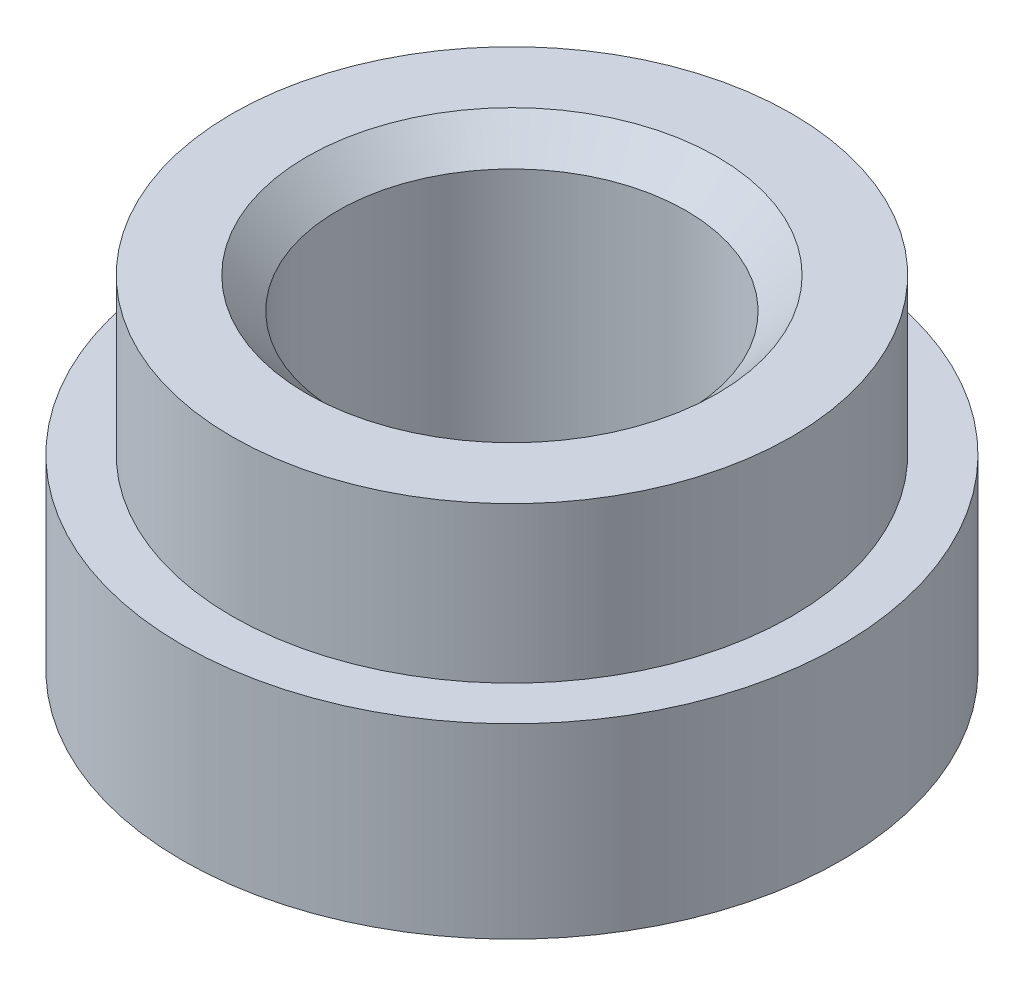
ISO-10303-21;
HEADER;
FILE_DESCRIPTION(('STEP AP214'),'2;1');
FILE_NAME('part.step','',(''),(''),'','','');
FILE_SCHEMA(('AUTOMOTIVE_DESIGN { 1 0 10303 214 1 1 1 1 }'));
ENDSEC;
DATA;
#1=APPLICATION_CONTEXT('core data for automotive mechanical design processes');
#2=APPLICATION_PROTOCOL_DEFINITION('international standard','automotive_design',2000,#1);
#3=PRODUCT_CONTEXT('',#1,'mechanical');
#4=PRODUCT('Part','Part','',(#3));
#5=PRODUCT_RELATED_PRODUCT_CATEGORY('part','',(#4));
#6=PRODUCT_DEFINITION_FORMATION('','',#4);
#7=PRODUCT_DEFINITION_CONTEXT('part definition',#1,'design');
#8=PRODUCT_DEFINITION('design','',#6,#7);
#9=PRODUCT_DEFINITION_SHAPE('','',#8);
#10=(LENGTH_UNIT() NAMED_UNIT(*) SI_UNIT(.MILLI.,.METRE.));
#11=(NAMED_UNIT(*) PLANE_ANGLE_UNIT() SI_UNIT($,.RADIAN.));
#12=(NAMED_UNIT(*) SI_UNIT($,.STERADIAN.) SOLID_ANGLE_UNIT());
#13=UNCERTAINTY_MEASURE_WITH_UNIT(LENGTH_MEASURE(1.E-05),#10,'distance_accuracy_value','');
#14=(GEOMETRIC_REPRESENTATION_CONTEXT(3) GLOBAL_UNCERTAINTY_ASSIGNED_CONTEXT((#13)) GLOBAL_UNIT_ASSIGNED_CONTEXT((#10,
#11,#12)) REPRESENTATION_CONTEXT('',''));
#15=CARTESIAN_POINT('',(0.,0.,0.));
#16=DIRECTION('',(0.,0.,1.));
#17=DIRECTION('',(1.,0.,0.));
#18=AXIS2_PLACEMENT_3D('',#15,#16,#17);
#19=CARTESIAN_POINT('',(0.,1.5,0.));
#20=DIRECTION('',(0.,-1.,0.));
#21=DIRECTION('',(0.,0.,-1.));
#22=AXIS2_PLACEMENT_3D('',#19,#20,#21);
#23=CYLINDRICAL_SURFACE('',#22,2.65000000000004);
#24=CARTESIAN_POINT('',(0.,1.5,0.));
#25=DIRECTION('',(0.,1.,0.));
#26=DIRECTION('',(0.,0.,1.));
#27=AXIS2_PLACEMENT_3D('',#24,#25,#26);
#28=CIRCLE('',#27,2.65000000000004);
#29=CARTESIAN_POINT('',(0.,1.5,2.65000000000004));
#30=VERTEX_POINT('',#29);
#31=EDGE_CURVE('E51',#30,#30,#28,.T.);
#32=ORIENTED_EDGE('',*,*,#31,.F.);
#33=EDGE_LOOP('',(#32));
#34=FACE_BOUND('',#33,.T.);
#35=CARTESIAN_POINT('',(0.,0.,0.));
#36=DIRECTION('',(0.,1.,0.));
#37=DIRECTION('',(0.,0.,1.));
#38=AXIS2_PLACEMENT_3D('',#35,#36,#37);
#39=CIRCLE('',#38,2.65000000000004);
#40=CARTESIAN_POINT('',(0.,0.,2.65000000000004));
#41=VERTEX_POINT('',#40);
#42=EDGE_CURVE('E52',#41,#41,#39,.T.);
#43=ORIENTED_EDGE('',*,*,#42,.T.);
#44=EDGE_LOOP('',(#43));
#45=FACE_BOUND('',#44,.T.);
#46=ADVANCED_FACE('F31',(#34,#45),#23,.T.);
#47=CARTESIAN_POINT('',(0.,1.5,0.));
#48=DIRECTION('',(0.,1.,0.));
#49=DIRECTION('',(0.,0.,1.));
#50=AXIS2_PLACEMENT_3D('',#47,#48,#49);
#51=PLANE('',#50);
#52=CARTESIAN_POINT('',(0.,1.5,0.));
#53=DIRECTION('',(0.,1.,0.));
#54=DIRECTION('',(0.,0.,1.));
#55=AXIS2_PLACEMENT_3D('',#52,#53,#54);
#56=CIRCLE('',#55,2.25);
#57=CARTESIAN_POINT('',(0.,1.5,2.25));
#58=VERTEX_POINT('',#57);
#59=EDGE_CURVE('E58',#58,#58,#56,.T.);
#60=ORIENTED_EDGE('',*,*,#59,.F.);
#61=EDGE_LOOP('',(#60));
#62=FACE_BOUND('',#61,.T.);
#63=ORIENTED_EDGE('',*,*,#31,.T.);
#64=EDGE_LOOP('',(#63));
#65=FACE_BOUND('',#64,.T.);
#66=ADVANCED_FACE('F73',(#62,#65),#51,.T.);
#67=CARTESIAN_POINT('',(0.,0.,0.));
#68=DIRECTION('',(0.,1.,0.));
#69=DIRECTION('',(0.,0.,1.));
#70=AXIS2_PLACEMENT_3D('',#67,#68,#69);
#71=PLANE('',#70);
#72=CARTESIAN_POINT('',(0.,0.,0.));
#73=DIRECTION('',(0.,1.,0.));
#74=DIRECTION('',(0.,0.,1.));
#75=AXIS2_PLACEMENT_3D('',#72,#73,#74);
#76=CIRCLE('',#75,1.65);
#77=CARTESIAN_POINT('',(0.,0.,1.65));
#78=VERTEX_POINT('',#77);
#79=EDGE_CURVE('E10',#78,#78,#76,.T.);
#80=ORIENTED_EDGE('',*,*,#79,.T.);
#81=EDGE_LOOP('',(#80));
#82=FACE_BOUND('',#81,.T.);
#83=ORIENTED_EDGE('',*,*,#42,.F.);
#84=EDGE_LOOP('',(#83));
#85=FACE_BOUND('',#84,.T.);
#86=ADVANCED_FACE('F69',(#82,#85),#71,.F.);
#87=CARTESIAN_POINT('',(0.,2.75,0.));
#88=DIRECTION('',(0.,-1.,0.));
#89=DIRECTION('',(0.,0.,-1.));
#90=AXIS2_PLACEMENT_3D('',#87,#88,#89);
#91=CYLINDRICAL_SURFACE('',#90,2.25);
#92=CARTESIAN_POINT('',(0.,2.75,0.));
#93=DIRECTION('',(0.,1.,0.));
#94=DIRECTION('',(0.,0.,1.));
#95=AXIS2_PLACEMENT_3D('',#92,#93,#94);
#96=CIRCLE('',#95,2.25);
#97=CARTESIAN_POINT('',(0.,2.75,2.25));
#98=VERTEX_POINT('',#97);
#99=EDGE_CURVE('E55',#98,#98,#96,.T.);
#100=ORIENTED_EDGE('',*,*,#99,.F.);
#101=EDGE_LOOP('',(#100));
#102=FACE_BOUND('',#101,.T.);
#103=ORIENTED_EDGE('',*,*,#59,.T.);
#104=EDGE_LOOP('',(#103));
#105=FACE_BOUND('',#104,.T.);
#106=ADVANCED_FACE('F66',(#102,#105),#91,.T.);
#107=CARTESIAN_POINT('',(0.,2.75,0.));
#108=DIRECTION('',(0.,1.,0.));
#109=DIRECTION('',(0.,0.,1.));
#110=AXIS2_PLACEMENT_3D('',#107,#108,#109);
#111=PLANE('',#110);
#112=CARTESIAN_POINT('',(0.,2.75,0.));
#113=DIRECTION('',(0.,1.,0.));
#114=DIRECTION('',(0.,0.,1.));
#115=AXIS2_PLACEMENT_3D('',#112,#113,#114);
#116=CIRCLE('',#115,1.65);
#117=CARTESIAN_POINT('',(0.,2.75,1.65));
#118=VERTEX_POINT('',#117);
#119=EDGE_CURVE('E38',#118,#118,#116,.F.);
#120=ORIENTED_EDGE('',*,*,#119,.T.);
#121=EDGE_LOOP('',(#120));
#122=FACE_BOUND('',#121,.T.);
#123=ORIENTED_EDGE('',*,*,#99,.T.);
#124=EDGE_LOOP('',(#123));
#125=FACE_BOUND('',#124,.T.);
#126=ADVANCED_FACE('F64',(#122,#125),#111,.T.);
#127=CARTESIAN_POINT('',(0.,0.,0.));
#128=DIRECTION('',(0.,1.,0.));
#129=DIRECTION('',(0.,0.,1.));
#130=AXIS2_PLACEMENT_3D('',#127,#128,#129);
#131=CYLINDRICAL_SURFACE('',#130,1.4);
#132=CARTESIAN_POINT('',(0.,2.5,0.));
#133=DIRECTION('',(0.,1.,0.));
#134=DIRECTION('',(0.,0.,1.));
#135=AXIS2_PLACEMENT_3D('',#132,#133,#134);
#136=CIRCLE('',#135,1.4);
#137=CARTESIAN_POINT('',(0.,2.5,1.4));
#138=VERTEX_POINT('',#137);
#139=EDGE_CURVE('E42',#138,#138,#136,.T.);
#140=ORIENTED_EDGE('',*,*,#139,.T.);
#141=EDGE_LOOP('',(#140));
#142=FACE_BOUND('',#141,.T.);
#143=CARTESIAN_POINT('',(0.,0.249999999999999,0.));
#144=DIRECTION('',(0.,1.,0.));
#145=DIRECTION('',(0.,0.,1.));
#146=AXIS2_PLACEMENT_3D('',#143,#144,#145);
#147=CIRCLE('',#146,1.4);
#148=CARTESIAN_POINT('',(0.,0.249999999999999,1.4));
#149=VERTEX_POINT('',#148);
#150=EDGE_CURVE('E46',#149,#149,#147,.F.);
#151=ORIENTED_EDGE('',*,*,#150,.T.);
#152=EDGE_LOOP('',(#151));
#153=FACE_BOUND('',#152,.T.);
#154=ADVANCED_FACE('F90',(#142,#153),#131,.F.);
#155=CARTESIAN_POINT('',(0.,2.5,0.));
#156=DIRECTION('',(0.,1.,0.));
#157=DIRECTION('',(0.,0.,1.));
#158=AXIS2_PLACEMENT_3D('',#155,#156,#157);
#159=CONICAL_SURFACE('',#158,1.4,0.785398163397448);
#160=ORIENTED_EDGE('',*,*,#119,.F.);
#161=EDGE_LOOP('',(#160));
#162=FACE_BOUND('',#161,.T.);
#163=ORIENTED_EDGE('',*,*,#139,.F.);
#164=EDGE_LOOP('',(#163));
#165=FACE_BOUND('',#164,.T.);
#166=ADVANCED_FACE('F88',(#162,#165),#159,.F.);
#167=CARTESIAN_POINT('',(0.,0.,0.));
#168=DIRECTION('',(0.,-1.,0.));
#169=DIRECTION('',(0.,0.,-1.));
#170=AXIS2_PLACEMENT_3D('',#167,#168,#169);
#171=CONICAL_SURFACE('',#170,1.65,0.785398163397447);
#172=ORIENTED_EDGE('',*,*,#150,.F.);
#173=EDGE_LOOP('',(#172));
#174=FACE_BOUND('',#173,.T.);
#175=ORIENTED_EDGE('',*,*,#79,.F.);
#176=EDGE_LOOP('',(#175));
#177=FACE_BOUND('',#176,.T.);
#178=ADVANCED_FACE('F33',(#174,#177),#171,.F.);
#179=CLOSED_SHELL('',(#46,#66,#86,#106,#126,#154,#166,#178));
#180=MANIFOLD_SOLID_BREP('B2',#179);
#181=ADVANCED_BREP_SHAPE_REPRESENTATION('',(#18,#180),#14);
#182=SHAPE_DEFINITION_REPRESENTATION(#9,#181);
ENDSEC;
END-ISO-10303-21;
